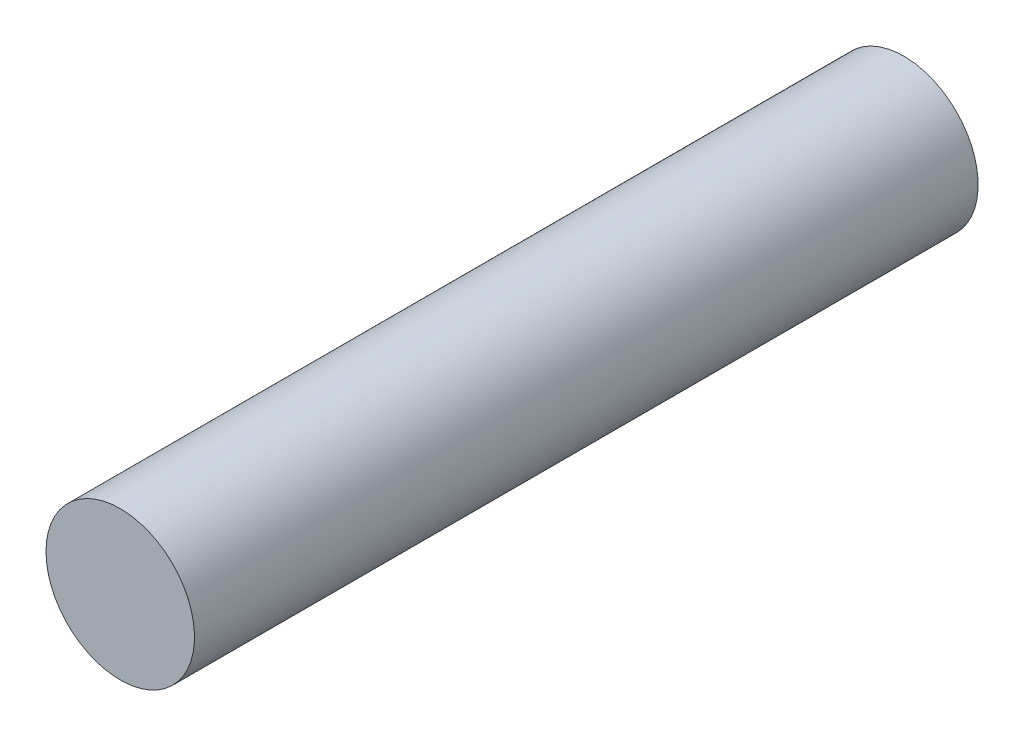
ISO-10303-21;
HEADER;
FILE_DESCRIPTION(('STEP AP214'),'2;1');
FILE_NAME('part.step','',(''),(''),'','','');
FILE_SCHEMA(('AUTOMOTIVE_DESIGN { 1 0 10303 214 1 1 1 1 }'));
ENDSEC;
DATA;
#1=APPLICATION_CONTEXT('core data for automotive mechanical design processes');
#2=APPLICATION_PROTOCOL_DEFINITION('international standard','automotive_design',2000,#1);
#3=PRODUCT_CONTEXT('',#1,'mechanical');
#4=PRODUCT('Part','Part','',(#3));
#5=PRODUCT_RELATED_PRODUCT_CATEGORY('part','',(#4));
#6=PRODUCT_DEFINITION_FORMATION('','',#4);
#7=PRODUCT_DEFINITION_CONTEXT('part definition',#1,'design');
#8=PRODUCT_DEFINITION('design','',#6,#7);
#9=PRODUCT_DEFINITION_SHAPE('','',#8);
#10=(LENGTH_UNIT() NAMED_UNIT(*) SI_UNIT(.MILLI.,.METRE.));
#11=(NAMED_UNIT(*) PLANE_ANGLE_UNIT() SI_UNIT($,.RADIAN.));
#12=(NAMED_UNIT(*) SI_UNIT($,.STERADIAN.) SOLID_ANGLE_UNIT());
#13=UNCERTAINTY_MEASURE_WITH_UNIT(LENGTH_MEASURE(1.E-05),#10,'distance_accuracy_value','');
#14=(GEOMETRIC_REPRESENTATION_CONTEXT(3) GLOBAL_UNCERTAINTY_ASSIGNED_CONTEXT((#13)) GLOBAL_UNIT_ASSIGNED_CONTEXT((#10,
#11,#12)) REPRESENTATION_CONTEXT('',''));
#15=CARTESIAN_POINT('',(0.,0.,0.));
#16=DIRECTION('',(0.,0.,1.));
#17=DIRECTION('',(1.,0.,0.));
#18=AXIS2_PLACEMENT_3D('',#15,#16,#17);
#19=CARTESIAN_POINT('',(0.,0.,950.));
#20=DIRECTION('',(0.,0.,-1.));
#21=DIRECTION('',(-1.,0.,0.));
#22=AXIS2_PLACEMENT_3D('',#19,#20,#21);
#23=CYLINDRICAL_SURFACE('',#22,90.);
#24=CARTESIAN_POINT('',(0.,0.,950.));
#25=DIRECTION('',(0.,0.,1.));
#26=DIRECTION('',(1.,0.,0.));
#27=AXIS2_PLACEMENT_3D('',#24,#25,#26);
#28=CIRCLE('',#27,90.);
#29=CARTESIAN_POINT('',(-90.,0.,950.));
#30=VERTEX_POINT('',#29);
#31=EDGE_CURVE('E10',#30,#30,#28,.T.);
#32=CARTESIAN_POINT('',(0.,0.,0.));
#33=DIRECTION('',(0.,0.,1.));
#34=DIRECTION('',(1.,0.,0.));
#35=AXIS2_PLACEMENT_3D('',#32,#33,#34);
#36=CIRCLE('',#35,90.);
#37=CARTESIAN_POINT('',(-90.,0.,-1.11022302462516E-13));
#38=VERTEX_POINT('',#37);
#39=EDGE_CURVE('E38',#38,#38,#36,.T.);
#40=CARTESIAN_POINT('',(-90.,0.,950.));
#41=CARTESIAN_POINT('',(-90.,0.,940.104166666667));
#42=CARTESIAN_POINT('',(-90.,0.,930.208333333333));
#43=CARTESIAN_POINT('',(-90.,0.,910.416666666667));
#44=CARTESIAN_POINT('',(-90.,0.,900.520833333333));
#45=CARTESIAN_POINT('',(-90.,0.,880.729166666667));
#46=CARTESIAN_POINT('',(-90.,0.,870.833333333333));
#47=CARTESIAN_POINT('',(-90.,0.,851.041666666667));
#48=CARTESIAN_POINT('',(-90.,0.,841.145833333333));
#49=CARTESIAN_POINT('',(-90.,0.,821.354166666667));
#50=CARTESIAN_POINT('',(-90.,0.,811.458333333333));
#51=CARTESIAN_POINT('',(-90.,0.,791.666666666667));
#52=CARTESIAN_POINT('',(-90.,0.,781.770833333333));
#53=CARTESIAN_POINT('',(-90.,0.,761.979166666667));
#54=CARTESIAN_POINT('',(-90.,0.,752.083333333333));
#55=CARTESIAN_POINT('',(-90.,0.,732.291666666667));
#56=CARTESIAN_POINT('',(-90.,0.,722.395833333333));
#57=CARTESIAN_POINT('',(-90.,0.,702.604166666667));
#58=CARTESIAN_POINT('',(-90.,0.,692.708333333333));
#59=CARTESIAN_POINT('',(-90.,0.,672.916666666667));
#60=CARTESIAN_POINT('',(-90.,0.,663.020833333333));
#61=CARTESIAN_POINT('',(-90.,0.,643.229166666667));
#62=CARTESIAN_POINT('',(-90.,0.,633.333333333333));
#63=CARTESIAN_POINT('',(-90.,0.,613.541666666667));
#64=CARTESIAN_POINT('',(-90.,0.,603.645833333333));
#65=CARTESIAN_POINT('',(-90.,0.,583.854166666667));
#66=CARTESIAN_POINT('',(-90.,0.,573.958333333333));
#67=CARTESIAN_POINT('',(-90.,0.,554.166666666667));
#68=CARTESIAN_POINT('',(-90.,0.,544.270833333333));
#69=CARTESIAN_POINT('',(-90.,0.,524.479166666667));
#70=CARTESIAN_POINT('',(-90.,0.,514.583333333333));
#71=CARTESIAN_POINT('',(-90.,0.,494.791666666667));
#72=CARTESIAN_POINT('',(-90.,0.,484.895833333333));
#73=CARTESIAN_POINT('',(-90.,0.,465.104166666667));
#74=CARTESIAN_POINT('',(-90.,0.,455.208333333333));
#75=CARTESIAN_POINT('',(-90.,0.,435.416666666667));
#76=CARTESIAN_POINT('',(-90.,0.,425.520833333333));
#77=CARTESIAN_POINT('',(-90.,0.,405.729166666667));
#78=CARTESIAN_POINT('',(-90.,0.,395.833333333333));
#79=CARTESIAN_POINT('',(-90.,0.,376.041666666667));
#80=CARTESIAN_POINT('',(-90.,0.,366.145833333333));
#81=CARTESIAN_POINT('',(-90.,0.,346.354166666667));
#82=CARTESIAN_POINT('',(-90.,0.,336.458333333333));
#83=CARTESIAN_POINT('',(-90.,0.,316.666666666667));
#84=CARTESIAN_POINT('',(-90.,0.,306.770833333333));
#85=CARTESIAN_POINT('',(-90.,0.,286.979166666667));
#86=CARTESIAN_POINT('',(-90.,0.,277.083333333333));
#87=CARTESIAN_POINT('',(-90.,0.,257.291666666667));
#88=CARTESIAN_POINT('',(-90.,0.,247.395833333333));
#89=CARTESIAN_POINT('',(-90.,0.,227.604166666667));
#90=CARTESIAN_POINT('',(-90.,0.,217.708333333333));
#91=CARTESIAN_POINT('',(-90.,0.,197.916666666667));
#92=CARTESIAN_POINT('',(-90.,0.,188.020833333333));
#93=CARTESIAN_POINT('',(-90.,0.,168.229166666667));
#94=CARTESIAN_POINT('',(-90.,0.,158.333333333333));
#95=CARTESIAN_POINT('',(-90.,0.,138.541666666667));
#96=CARTESIAN_POINT('',(-90.,0.,128.645833333333));
#97=CARTESIAN_POINT('',(-90.,0.,108.854166666667));
#98=CARTESIAN_POINT('',(-90.,0.,98.9583333333333));
#99=CARTESIAN_POINT('',(-90.,0.,79.1666666666666));
#100=CARTESIAN_POINT('',(-90.,0.,69.2708333333332));
#101=CARTESIAN_POINT('',(-90.,0.,49.4791666666665));
#102=CARTESIAN_POINT('',(-90.,0.,39.5833333333332));
#103=CARTESIAN_POINT('',(-90.,0.,19.7916666666665));
#104=CARTESIAN_POINT('',(-90.,0.,9.89583333333321));
#105=CARTESIAN_POINT('',(-90.,0.,-1.11022302462516E-13));
#106=B_SPLINE_CURVE_WITH_KNOTS('',3,(#40,#41,#42,#43,#44,#45,#46,#47,#48,#49,#50,#51,#52,#53,
#54,#55,#56,#57,#58,#59,#60,#61,#62,#63,#64,#65,#66,#67,#68,#69,#70,#71,#72,#73,#74,#75,#76,#77,
#78,#79,#80,#81,#82,#83,#84,#85,#86,#87,#88,#89,#90,#91,#92,#93,#94,#95,#96,#97,#98,#99,#100,
#101,#102,#103,#104,#105),.UNSPECIFIED.,.F.,.F.,(4,2,2,2,2,2,2,2,2,2,2,2,2,2,2,2,2,2,2,2,2,2,2,
2,2,2,2,2,2,2,2,2,4),(0.,29.6875000000001,59.3750000000001,89.0625,118.75,148.4375,178.125,
207.8125,237.5,267.1875,296.875,326.5625,356.25,385.9375,415.625,445.3125,475.,504.6875,534.375,
564.0625,593.75,623.4375,653.125,682.8125,712.5,742.1875,771.875,801.5625,831.25,860.9375,
890.625,920.3125,950.),.UNSPECIFIED.);
#107=EDGE_CURVE('BSEAM35',#30,#38,#106,.T.);
#108=ORIENTED_EDGE('',*,*,#31,.F.);
#109=ORIENTED_EDGE('',*,*,#39,.T.);
#110=ORIENTED_EDGE('',*,*,#107,.T.);
#111=ORIENTED_EDGE('',*,*,#107,.F.);
#112=EDGE_LOOP('',(#108,#110,#109,#111));
#113=FACE_BOUND('',#112,.T.);
#114=ADVANCED_FACE('F35',(#113),#23,.T.);
#115=CARTESIAN_POINT('',(0.,0.,950.));
#116=DIRECTION('',(0.,0.,1.));
#117=DIRECTION('',(1.,0.,0.));
#118=AXIS2_PLACEMENT_3D('',#115,#116,#117);
#119=PLANE('',#118);
#120=ORIENTED_EDGE('',*,*,#31,.T.);
#121=EDGE_LOOP('',(#120));
#122=FACE_BOUND('',#121,.T.);
#123=ADVANCED_FACE('F50',(#122),#119,.T.);
#124=CARTESIAN_POINT('',(0.,0.,0.));
#125=DIRECTION('',(0.,0.,1.));
#126=DIRECTION('',(1.,0.,0.));
#127=AXIS2_PLACEMENT_3D('',#124,#125,#126);
#128=PLANE('',#127);
#129=ORIENTED_EDGE('',*,*,#39,.F.);
#130=EDGE_LOOP('',(#129));
#131=FACE_BOUND('',#130,.T.);
#132=ADVANCED_FACE('F48',(#131),#128,.F.);
#133=CLOSED_SHELL('',(#114,#123,#132));
#134=MANIFOLD_SOLID_BREP('B2',#133);
#135=ADVANCED_BREP_SHAPE_REPRESENTATION('',(#18,#134),#14);
#136=SHAPE_DEFINITION_REPRESENTATION(#9,#135);
ENDSEC;
END-ISO-10303-21;
